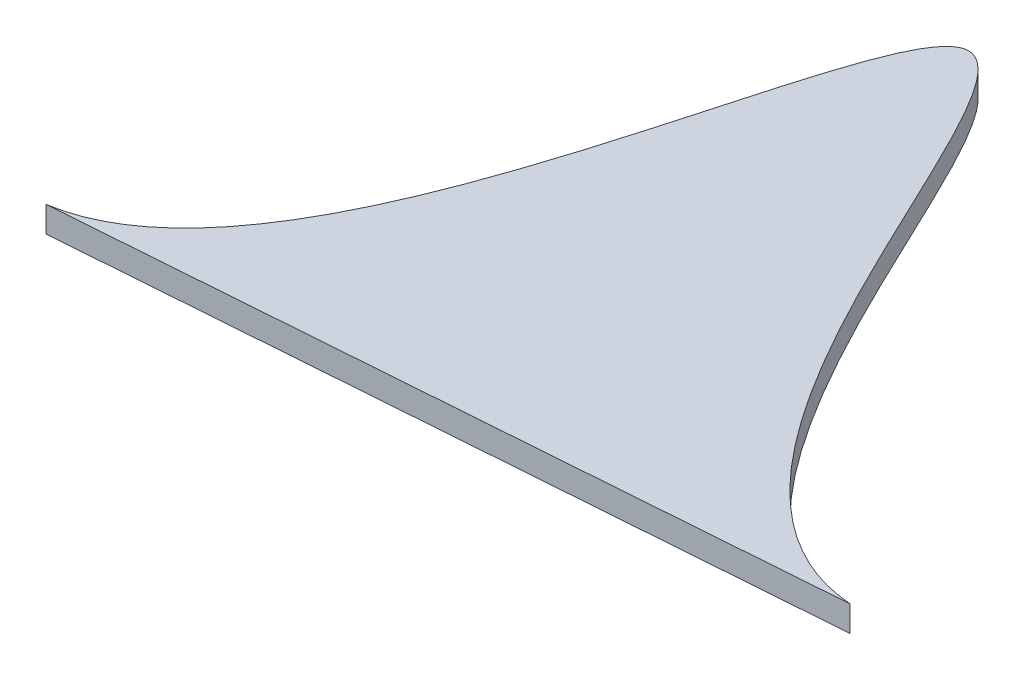
ISO-10303-21;
HEADER;
FILE_DESCRIPTION(('STEP AP214'),'2;1');
FILE_NAME('part.step','',(''),(''),'','','');
FILE_SCHEMA(('AUTOMOTIVE_DESIGN { 1 0 10303 214 1 1 1 1 }'));
ENDSEC;
DATA;
#1=APPLICATION_CONTEXT('core data for automotive mechanical design processes');
#2=APPLICATION_PROTOCOL_DEFINITION('international standard','automotive_design',2000,#1);
#3=PRODUCT_CONTEXT('',#1,'mechanical');
#4=PRODUCT('Part','Part','',(#3));
#5=PRODUCT_RELATED_PRODUCT_CATEGORY('part','',(#4));
#6=PRODUCT_DEFINITION_FORMATION('','',#4);
#7=PRODUCT_DEFINITION_CONTEXT('part definition',#1,'design');
#8=PRODUCT_DEFINITION('design','',#6,#7);
#9=PRODUCT_DEFINITION_SHAPE('','',#8);
#10=(LENGTH_UNIT() NAMED_UNIT(*) SI_UNIT(.MILLI.,.METRE.));
#11=(NAMED_UNIT(*) PLANE_ANGLE_UNIT() SI_UNIT($,.RADIAN.));
#12=(NAMED_UNIT(*) SI_UNIT($,.STERADIAN.) SOLID_ANGLE_UNIT());
#13=UNCERTAINTY_MEASURE_WITH_UNIT(LENGTH_MEASURE(1.E-05),#10,'distance_accuracy_value','');
#14=(GEOMETRIC_REPRESENTATION_CONTEXT(3) GLOBAL_UNCERTAINTY_ASSIGNED_CONTEXT((#13)) GLOBAL_UNIT_ASSIGNED_CONTEXT((#10,
#11,#12)) REPRESENTATION_CONTEXT('',''));
#15=CARTESIAN_POINT('',(0.,0.,0.));
#16=DIRECTION('',(0.,0.,1.));
#17=DIRECTION('',(1.,0.,0.));
#18=AXIS2_PLACEMENT_3D('',#15,#16,#17);
#19=CARTESIAN_POINT('',(0.,2.5,0.));
#20=CARTESIAN_POINT('',(47.3280122208656,2.5,0.178330263095778));
#21=CARTESIAN_POINT('',(58.4104037369828,2.5,-224.536415885851));
#22=CARTESIAN_POINT('',(105.975334824085,2.5,-14.3196652494006));
#23=CARTESIAN_POINT('',(150.,2.5,-11.2522290507014));
#24=B_SPLINE_CURVE_WITH_KNOTS('',3,(#19,#20,#21,#22,#23),.UNSPECIFIED.,.F.,.F.,(4,1,4),(0.,
0.503858774011912,1.),.UNSPECIFIED.);
#25=DIRECTION('',(0.,-1.,0.));
#26=VECTOR('',#25,1.);
#27=SURFACE_OF_LINEAR_EXTRUSION('',#24,#26);
#28=CARTESIAN_POINT('',(0.,-2.5,0.));
#29=CARTESIAN_POINT('',(47.3280122208656,-2.5,0.178330263095778));
#30=CARTESIAN_POINT('',(58.4104037369828,-2.5,-224.536415885851));
#31=CARTESIAN_POINT('',(105.975334824085,-2.5,-14.3196652494006));
#32=CARTESIAN_POINT('',(150.,-2.5,-11.2522290507014));
#33=B_SPLINE_CURVE_WITH_KNOTS('',3,(#28,#29,#30,#31,#32),.UNSPECIFIED.,.F.,.F.,(4,1,4),(0.,
0.503858774011912,1.),.UNSPECIFIED.);
#34=CARTESIAN_POINT('',(4.50967690495098,-2.5,-0.338292783194444));
#35=VERTEX_POINT('',#34);
#36=CARTESIAN_POINT('',(150.,-2.5,-11.2522290507014));
#37=VERTEX_POINT('',#36);
#38=EDGE_CURVE('E64',#35,#37,#33,.T.);
#39=ORIENTED_EDGE('',*,*,#38,.F.);
#40=DIRECTION('',(0.,-1.,0.));
#41=VECTOR('',#40,1.);
#42=CARTESIAN_POINT('',(4.50967690495098,2.5,-0.338292783194444));
#43=LINE('',#42,#41);
#44=CARTESIAN_POINT('',(4.50967690495098,2.5,-0.338292783194444));
#45=VERTEX_POINT('',#44);
#46=EDGE_CURVE('E11',#45,#35,#43,.T.);
#47=ORIENTED_EDGE('',*,*,#46,.F.);
#48=CARTESIAN_POINT('',(150.,2.5,-11.2522290507014));
#49=VERTEX_POINT('',#48);
#50=EDGE_CURVE('E65',#45,#49,#24,.T.);
#51=ORIENTED_EDGE('',*,*,#50,.T.);
#52=DIRECTION('',(0.,-1.,0.));
#53=VECTOR('',#52,1.);
#54=CARTESIAN_POINT('',(150.,2.5,-11.2522290507014));
#55=LINE('',#54,#53);
#56=EDGE_CURVE('E44',#49,#37,#55,.T.);
#57=ORIENTED_EDGE('',*,*,#56,.T.);
#58=EDGE_LOOP('',(#39,#47,#51,#57));
#59=FACE_BOUND('',#58,.T.);
#60=ADVANCED_FACE('F35',(#59),#27,.T.);
#61=CARTESIAN_POINT('',(0.,2.5,0.));
#62=DIRECTION('',(-0.0748046840469005,0.,-0.997198204593572));
#63=DIRECTION('',(-0.997198204593572,0.,0.0748046840469005));
#64=AXIS2_PLACEMENT_3D('',#61,#62,#63);
#65=PLANE('',#64);
#66=DIRECTION('',(0.997198204593572,0.,-0.0748046840469005));
#67=VECTOR('',#66,1.);
#68=CARTESIAN_POINT('',(0.,-2.5,0.));
#69=LINE('',#68,#67);
#70=EDGE_CURVE('E66',#35,#37,#69,.T.);
#71=ORIENTED_EDGE('',*,*,#70,.T.);
#72=ORIENTED_EDGE('',*,*,#56,.F.);
#73=DIRECTION('',(0.997198204593572,0.,-0.0748046840469005));
#74=VECTOR('',#73,1.);
#75=CARTESIAN_POINT('',(0.,2.5,0.));
#76=LINE('',#75,#74);
#77=EDGE_CURVE('E51',#45,#49,#76,.T.);
#78=ORIENTED_EDGE('',*,*,#77,.F.);
#79=ORIENTED_EDGE('',*,*,#46,.T.);
#80=EDGE_LOOP('',(#71,#72,#78,#79));
#81=FACE_BOUND('',#80,.T.);
#82=ADVANCED_FACE('F67',(#81),#65,.F.);
#83=CARTESIAN_POINT('',(0.,2.5,0.));
#84=DIRECTION('',(0.,1.,0.));
#85=DIRECTION('',(0.,0.,1.));
#86=AXIS2_PLACEMENT_3D('',#83,#84,#85);
#87=PLANE('',#86);
#88=ORIENTED_EDGE('',*,*,#50,.F.);
#89=ORIENTED_EDGE('',*,*,#77,.T.);
#90=EDGE_LOOP('',(#88,#89));
#91=FACE_BOUND('',#90,.T.);
#92=ADVANCED_FACE('F85',(#91),#87,.T.);
#93=CARTESIAN_POINT('',(0.,-2.5,0.));
#94=DIRECTION('',(0.,1.,0.));
#95=DIRECTION('',(0.,0.,1.));
#96=AXIS2_PLACEMENT_3D('',#93,#94,#95);
#97=PLANE('',#96);
#98=ORIENTED_EDGE('',*,*,#38,.T.);
#99=ORIENTED_EDGE('',*,*,#70,.F.);
#100=EDGE_LOOP('',(#98,#99));
#101=FACE_BOUND('',#100,.T.);
#102=ADVANCED_FACE('F70',(#101),#97,.F.);
#103=CLOSED_SHELL('',(#60,#82,#92,#102));
#104=MANIFOLD_SOLID_BREP('B2',#103);
#105=ADVANCED_BREP_SHAPE_REPRESENTATION('',(#18,#104),#14);
#106=SHAPE_DEFINITION_REPRESENTATION(#9,#105);
ENDSEC;
END-ISO-10303-21;
